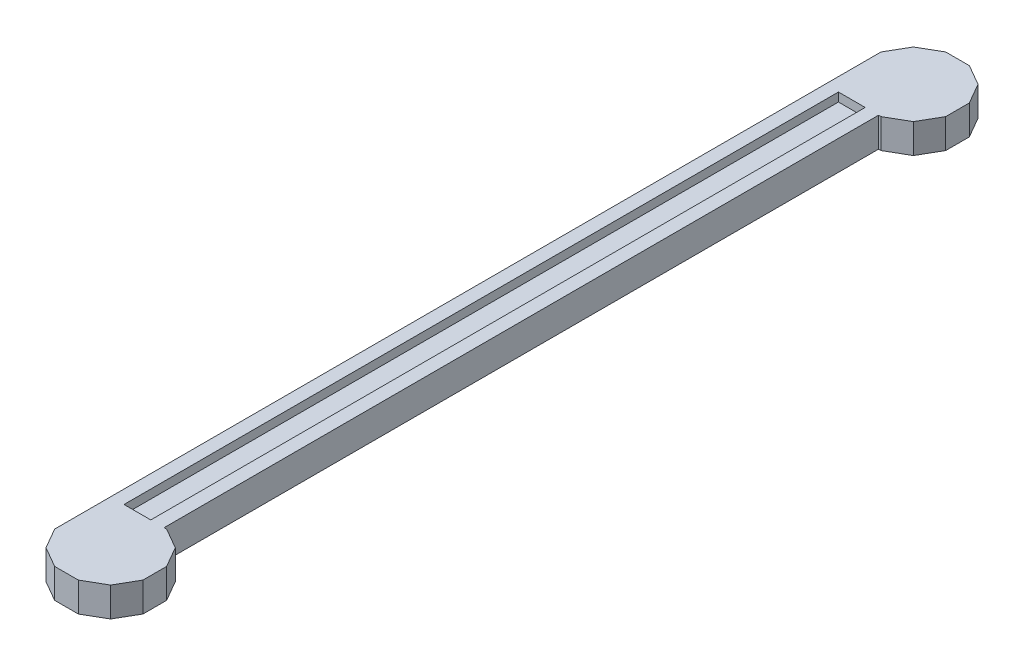
ISO-10303-21;
HEADER;
FILE_DESCRIPTION(('STEP AP214'),'2;1');
FILE_NAME('part.step','',(''),(''),'','','');
FILE_SCHEMA(('AUTOMOTIVE_DESIGN { 1 0 10303 214 1 1 1 1 }'));
ENDSEC;
DATA;
#1=APPLICATION_CONTEXT('core data for automotive mechanical design processes');
#2=APPLICATION_PROTOCOL_DEFINITION('international standard','automotive_design',2000,#1);
#3=PRODUCT_CONTEXT('',#1,'mechanical');
#4=PRODUCT('Part','Part','',(#3));
#5=PRODUCT_RELATED_PRODUCT_CATEGORY('part','',(#4));
#6=PRODUCT_DEFINITION_FORMATION('','',#4);
#7=PRODUCT_DEFINITION_CONTEXT('part definition',#1,'design');
#8=PRODUCT_DEFINITION('design','',#6,#7);
#9=PRODUCT_DEFINITION_SHAPE('','',#8);
#10=(LENGTH_UNIT() NAMED_UNIT(*) SI_UNIT(.MILLI.,.METRE.));
#11=(NAMED_UNIT(*) PLANE_ANGLE_UNIT() SI_UNIT($,.RADIAN.));
#12=(NAMED_UNIT(*) SI_UNIT($,.STERADIAN.) SOLID_ANGLE_UNIT());
#13=UNCERTAINTY_MEASURE_WITH_UNIT(LENGTH_MEASURE(1.E-05),#10,'distance_accuracy_value','');
#14=(GEOMETRIC_REPRESENTATION_CONTEXT(3) GLOBAL_UNCERTAINTY_ASSIGNED_CONTEXT((#13)) GLOBAL_UNIT_ASSIGNED_CONTEXT((#10,
#11,#12)) REPRESENTATION_CONTEXT('',''));
#15=CARTESIAN_POINT('',(0.,0.,0.));
#16=DIRECTION('',(0.,0.,1.));
#17=DIRECTION('',(1.,0.,0.));
#18=AXIS2_PLACEMENT_3D('',#15,#16,#17);
#19=CARTESIAN_POINT('',(33.,-11.,608.842323350227));
#20=DIRECTION('',(1.,0.,0.));
#21=DIRECTION('',(0.,0.,-1.));
#22=AXIS2_PLACEMENT_3D('',#19,#20,#21);
#23=PLANE('',#22);
#24=DIRECTION('',(0.,-1.,0.));
#25=VECTOR('',#24,1.);
#26=CARTESIAN_POINT('',(33.,11.,8.84232335022704));
#27=LINE('',#26,#25);
#28=CARTESIAN_POINT('',(33.,11.,8.84232335022704));
#29=VERTEX_POINT('',#28);
#30=CARTESIAN_POINT('',(33.,-11.,8.84232335022704));
#31=VERTEX_POINT('',#30);
#32=EDGE_CURVE('E312',#29,#31,#27,.T.);
#33=ORIENTED_EDGE('',*,*,#32,.T.);
#34=DIRECTION('',(0.,0.,-1.));
#35=VECTOR('',#34,1.);
#36=CARTESIAN_POINT('',(33.,-11.,608.842323350227));
#37=LINE('',#36,#35);
#38=CARTESIAN_POINT('',(33.,-11.,-8.84232335022705));
#39=VERTEX_POINT('',#38);
#40=EDGE_CURVE('E382',#31,#39,#37,.T.);
#41=ORIENTED_EDGE('',*,*,#40,.T.);
#42=DIRECTION('',(0.,1.,0.));
#43=VECTOR('',#42,1.);
#44=CARTESIAN_POINT('',(33.,-11.,-8.84232335022705));
#45=LINE('',#44,#43);
#46=CARTESIAN_POINT('',(33.,11.,-8.84232335022705));
#47=VERTEX_POINT('',#46);
#48=EDGE_CURVE('E11',#39,#47,#45,.T.);
#49=ORIENTED_EDGE('',*,*,#48,.T.);
#50=DIRECTION('',(0.,0.,-1.));
#51=VECTOR('',#50,1.);
#52=CARTESIAN_POINT('',(33.,11.,608.842323350227));
#53=LINE('',#52,#51);
#54=EDGE_CURVE('E418',#29,#47,#53,.T.);
#55=ORIENTED_EDGE('',*,*,#54,.F.);
#56=EDGE_LOOP('',(#33,#41,#49,#55));
#57=FACE_BOUND('',#56,.T.);
#58=ADVANCED_FACE('F34',(#57),#23,.T.);
#59=CARTESIAN_POINT('',(33.,-11.,-8.84232335022705));
#60=DIRECTION('',(0.866025403784439,0.,-0.499999999999999));
#61=DIRECTION('',(-0.499999999999999,0.,-0.866025403784439));
#62=AXIS2_PLACEMENT_3D('',#59,#60,#61);
#63=PLANE('',#62);
#64=DIRECTION('',(-0.499999999999999,0.,-0.866025403784439));
#65=VECTOR('',#64,1.);
#66=CARTESIAN_POINT('',(33.,11.,-8.84232335022705));
#67=LINE('',#66,#65);
#68=CARTESIAN_POINT('',(24.1576766497729,11.,-24.157676649773));
#69=VERTEX_POINT('',#68);
#70=EDGE_CURVE('E333',#47,#69,#67,.T.);
#71=ORIENTED_EDGE('',*,*,#70,.F.);
#72=ORIENTED_EDGE('',*,*,#48,.F.);
#73=DIRECTION('',(-0.499999999999999,0.,-0.866025403784439));
#74=VECTOR('',#73,1.);
#75=CARTESIAN_POINT('',(33.,-11.,-8.84232335022705));
#76=LINE('',#75,#74);
#77=CARTESIAN_POINT('',(24.1576766497729,-11.,-24.157676649773));
#78=VERTEX_POINT('',#77);
#79=EDGE_CURVE('E348',#39,#78,#76,.T.);
#80=ORIENTED_EDGE('',*,*,#79,.T.);
#81=DIRECTION('',(0.,1.,0.));
#82=VECTOR('',#81,1.);
#83=CARTESIAN_POINT('',(24.1576766497729,-11.,-24.157676649773));
#84=LINE('',#83,#82);
#85=EDGE_CURVE('E38',#78,#69,#84,.T.);
#86=ORIENTED_EDGE('',*,*,#85,.T.);
#87=EDGE_LOOP('',(#71,#72,#80,#86));
#88=FACE_BOUND('',#87,.T.);
#89=ADVANCED_FACE('F36',(#88),#63,.T.);
#90=DIRECTION('',(0.,-1.,0.));
#91=VECTOR('',#90,1.);
#92=CARTESIAN_POINT('',(33.,11.,591.157676649773));
#93=LINE('',#92,#91);
#94=CARTESIAN_POINT('',(33.,11.,591.157676649773));
#95=VERTEX_POINT('',#94);
#96=CARTESIAN_POINT('',(33.,-11.,591.157676649773));
#97=VERTEX_POINT('',#96);
#98=EDGE_CURVE('E344',#95,#97,#93,.T.);
#99=ORIENTED_EDGE('',*,*,#98,.F.);
#100=CARTESIAN_POINT('',(33.,11.,608.842323350227));
#101=VERTEX_POINT('',#100);
#102=EDGE_CURVE('E352',#101,#95,#53,.T.);
#103=ORIENTED_EDGE('',*,*,#102,.F.);
#104=DIRECTION('',(0.,1.,0.));
#105=VECTOR('',#104,1.);
#106=CARTESIAN_POINT('',(33.,-11.,608.842323350227));
#107=LINE('',#106,#105);
#108=CARTESIAN_POINT('',(33.,-11.,608.842323350227));
#109=VERTEX_POINT('',#108);
#110=EDGE_CURVE('E43',#109,#101,#107,.T.);
#111=ORIENTED_EDGE('',*,*,#110,.F.);
#112=EDGE_CURVE('E383',#109,#97,#37,.T.);
#113=ORIENTED_EDGE('',*,*,#112,.T.);
#114=EDGE_LOOP('',(#99,#103,#111,#113));
#115=FACE_BOUND('',#114,.T.);
#116=ADVANCED_FACE('F495',(#115),#23,.T.);
#117=CARTESIAN_POINT('',(24.1576766497731,-11.,624.157676649773));
#118=DIRECTION('',(0.866025403784445,0.,0.49999999999999));
#119=DIRECTION('',(0.49999999999999,0.,-0.866025403784445));
#120=AXIS2_PLACEMENT_3D('',#117,#118,#119);
#121=PLANE('',#120);
#122=DIRECTION('',(0.49999999999999,0.,-0.866025403784445));
#123=VECTOR('',#122,1.);
#124=CARTESIAN_POINT('',(24.1576766497731,11.,624.157676649773));
#125=LINE('',#124,#123);
#126=CARTESIAN_POINT('',(24.1576766497731,11.,624.157676649773));
#127=VERTEX_POINT('',#126);
#128=EDGE_CURVE('E415',#127,#101,#125,.T.);
#129=ORIENTED_EDGE('',*,*,#128,.F.);
#130=DIRECTION('',(0.,1.,0.));
#131=VECTOR('',#130,1.);
#132=CARTESIAN_POINT('',(24.1576766497731,-11.,624.157676649773));
#133=LINE('',#132,#131);
#134=CARTESIAN_POINT('',(24.1576766497731,-11.,624.157676649773));
#135=VERTEX_POINT('',#134);
#136=EDGE_CURVE('E422',#135,#127,#133,.T.);
#137=ORIENTED_EDGE('',*,*,#136,.F.);
#138=DIRECTION('',(0.49999999999999,0.,-0.866025403784445));
#139=VECTOR('',#138,1.);
#140=CARTESIAN_POINT('',(24.1576766497731,-11.,624.157676649773));
#141=LINE('',#140,#139);
#142=EDGE_CURVE('E379',#135,#109,#141,.T.);
#143=ORIENTED_EDGE('',*,*,#142,.T.);
#144=ORIENTED_EDGE('',*,*,#110,.T.);
#145=EDGE_LOOP('',(#129,#137,#143,#144));
#146=FACE_BOUND('',#145,.T.);
#147=ADVANCED_FACE('F491',(#146),#121,.T.);
#148=CARTESIAN_POINT('',(8.84232335022723,-11.,633.));
#149=DIRECTION('',(0.499999999999998,0.,0.86602540378444));
#150=DIRECTION('',(0.86602540378444,0.,-0.499999999999998));
#151=AXIS2_PLACEMENT_3D('',#148,#149,#150);
#152=PLANE('',#151);
#153=DIRECTION('',(0.86602540378444,0.,-0.499999999999997));
#154=VECTOR('',#153,1.);
#155=CARTESIAN_POINT('',(8.84232335022723,11.,633.));
#156=LINE('',#155,#154);
#157=CARTESIAN_POINT('',(8.84232335022723,11.,633.));
#158=VERTEX_POINT('',#157);
#159=EDGE_CURVE('E412',#158,#127,#156,.T.);
#160=ORIENTED_EDGE('',*,*,#159,.F.);
#161=DIRECTION('',(0.,1.,0.));
#162=VECTOR('',#161,1.);
#163=CARTESIAN_POINT('',(8.84232335022723,-11.,633.));
#164=LINE('',#163,#162);
#165=CARTESIAN_POINT('',(8.84232335022723,-11.,633.));
#166=VERTEX_POINT('',#165);
#167=EDGE_CURVE('E424',#166,#158,#164,.T.);
#168=ORIENTED_EDGE('',*,*,#167,.F.);
#169=DIRECTION('',(0.86602540378444,0.,-0.499999999999997));
#170=VECTOR('',#169,1.);
#171=CARTESIAN_POINT('',(8.84232335022723,-11.,633.));
#172=LINE('',#171,#170);
#173=EDGE_CURVE('E376',#166,#135,#172,.T.);
#174=ORIENTED_EDGE('',*,*,#173,.T.);
#175=ORIENTED_EDGE('',*,*,#136,.T.);
#176=EDGE_LOOP('',(#160,#168,#174,#175));
#177=FACE_BOUND('',#176,.T.);
#178=ADVANCED_FACE('F487',(#177),#152,.T.);
#179=CARTESIAN_POINT('',(-8.84232335022699,-11.,633.));
#180=DIRECTION('',(0.,0.,1.));
#181=DIRECTION('',(1.,0.,0.));
#182=AXIS2_PLACEMENT_3D('',#179,#180,#181);
#183=PLANE('',#182);
#184=DIRECTION('',(1.,0.,0.));
#185=VECTOR('',#184,1.);
#186=CARTESIAN_POINT('',(-8.84232335022699,11.,633.));
#187=LINE('',#186,#185);
#188=CARTESIAN_POINT('',(-8.84232335022699,11.,633.));
#189=VERTEX_POINT('',#188);
#190=EDGE_CURVE('E409',#189,#158,#187,.T.);
#191=ORIENTED_EDGE('',*,*,#190,.F.);
#192=DIRECTION('',(0.,1.,0.));
#193=VECTOR('',#192,1.);
#194=CARTESIAN_POINT('',(-8.84232335022699,-11.,633.));
#195=LINE('',#194,#193);
#196=CARTESIAN_POINT('',(-8.84232335022699,-11.,633.));
#197=VERTEX_POINT('',#196);
#198=EDGE_CURVE('E426',#197,#189,#195,.T.);
#199=ORIENTED_EDGE('',*,*,#198,.F.);
#200=DIRECTION('',(1.,0.,0.));
#201=VECTOR('',#200,1.);
#202=CARTESIAN_POINT('',(-8.84232335022699,-11.,633.));
#203=LINE('',#202,#201);
#204=EDGE_CURVE('E373',#197,#166,#203,.T.);
#205=ORIENTED_EDGE('',*,*,#204,.T.);
#206=ORIENTED_EDGE('',*,*,#167,.T.);
#207=EDGE_LOOP('',(#191,#199,#205,#206));
#208=FACE_BOUND('',#207,.T.);
#209=ADVANCED_FACE('F482',(#208),#183,.T.);
#210=CARTESIAN_POINT('',(-24.1576766497729,-11.,624.157676649773));
#211=DIRECTION('',(-0.499999999999994,0.,0.866025403784442));
#212=DIRECTION('',(0.866025403784442,0.,0.499999999999994));
#213=AXIS2_PLACEMENT_3D('',#210,#211,#212);
#214=PLANE('',#213);
#215=DIRECTION('',(0.866025403784442,0.,0.499999999999994));
#216=VECTOR('',#215,1.);
#217=CARTESIAN_POINT('',(-24.1576766497729,11.,624.157676649773));
#218=LINE('',#217,#216);
#219=CARTESIAN_POINT('',(-24.1576766497729,11.,624.157676649773));
#220=VERTEX_POINT('',#219);
#221=EDGE_CURVE('E406',#220,#189,#218,.T.);
#222=ORIENTED_EDGE('',*,*,#221,.F.);
#223=DIRECTION('',(0.,1.,0.));
#224=VECTOR('',#223,1.);
#225=CARTESIAN_POINT('',(-24.1576766497729,-11.,624.157676649773));
#226=LINE('',#225,#224);
#227=CARTESIAN_POINT('',(-24.1576766497729,-11.,624.157676649773));
#228=VERTEX_POINT('',#227);
#229=EDGE_CURVE('E428',#228,#220,#226,.T.);
#230=ORIENTED_EDGE('',*,*,#229,.F.);
#231=DIRECTION('',(0.866025403784442,0.,0.499999999999994));
#232=VECTOR('',#231,1.);
#233=CARTESIAN_POINT('',(-24.1576766497729,-11.,624.157676649773));
#234=LINE('',#233,#232);
#235=EDGE_CURVE('E370',#228,#197,#234,.T.);
#236=ORIENTED_EDGE('',*,*,#235,.T.);
#237=ORIENTED_EDGE('',*,*,#198,.T.);
#238=EDGE_LOOP('',(#222,#230,#236,#237));
#239=FACE_BOUND('',#238,.T.);
#240=ADVANCED_FACE('F478',(#239),#214,.T.);
#241=CARTESIAN_POINT('',(-33.,-11.,608.842323350227));
#242=DIRECTION('',(-0.866025403784442,0.,0.499999999999994));
#243=DIRECTION('',(0.499999999999994,0.,0.866025403784442));
#244=AXIS2_PLACEMENT_3D('',#241,#242,#243);
#245=PLANE('',#244);
#246=DIRECTION('',(0.499999999999994,0.,0.866025403784442));
#247=VECTOR('',#246,1.);
#248=CARTESIAN_POINT('',(-33.,11.,608.842323350227));
#249=LINE('',#248,#247);
#250=CARTESIAN_POINT('',(-33.,11.,608.842323350227));
#251=VERTEX_POINT('',#250);
#252=EDGE_CURVE('E403',#251,#220,#249,.T.);
#253=ORIENTED_EDGE('',*,*,#252,.F.);
#254=DIRECTION('',(0.,1.,0.));
#255=VECTOR('',#254,1.);
#256=CARTESIAN_POINT('',(-33.,-11.,608.842323350227));
#257=LINE('',#256,#255);
#258=CARTESIAN_POINT('',(-33.,-11.,608.842323350227));
#259=VERTEX_POINT('',#258);
#260=EDGE_CURVE('E430',#259,#251,#257,.T.);
#261=ORIENTED_EDGE('',*,*,#260,.F.);
#262=DIRECTION('',(0.499999999999994,0.,0.866025403784442));
#263=VECTOR('',#262,1.);
#264=CARTESIAN_POINT('',(-33.,-11.,608.842323350227));
#265=LINE('',#264,#263);
#266=EDGE_CURVE('E367',#259,#228,#265,.T.);
#267=ORIENTED_EDGE('',*,*,#266,.T.);
#268=ORIENTED_EDGE('',*,*,#229,.T.);
#269=EDGE_LOOP('',(#253,#261,#267,#268));
#270=FACE_BOUND('',#269,.T.);
#271=ADVANCED_FACE('F474',(#270),#245,.T.);
#272=CARTESIAN_POINT('',(-33.,-11.,-8.84232335022704));
#273=DIRECTION('',(-1.,0.,0.));
#274=DIRECTION('',(0.,0.,1.));
#275=AXIS2_PLACEMENT_3D('',#272,#273,#274);
#276=PLANE('',#275);
#277=DIRECTION('',(0.,0.,1.));
#278=VECTOR('',#277,1.);
#279=CARTESIAN_POINT('',(-33.,11.,-8.84232335022704));
#280=LINE('',#279,#278);
#281=CARTESIAN_POINT('',(-33.,11.,-8.84232335022704));
#282=VERTEX_POINT('',#281);
#283=EDGE_CURVE('E400',#282,#251,#280,.T.);
#284=ORIENTED_EDGE('',*,*,#283,.F.);
#285=DIRECTION('',(0.,1.,0.));
#286=VECTOR('',#285,1.);
#287=CARTESIAN_POINT('',(-33.,-11.,-8.84232335022704));
#288=LINE('',#287,#286);
#289=CARTESIAN_POINT('',(-33.,-11.,-8.84232335022704));
#290=VERTEX_POINT('',#289);
#291=EDGE_CURVE('E432',#290,#282,#288,.T.);
#292=ORIENTED_EDGE('',*,*,#291,.F.);
#293=DIRECTION('',(0.,0.,1.));
#294=VECTOR('',#293,1.);
#295=CARTESIAN_POINT('',(-33.,-11.,-8.84232335022704));
#296=LINE('',#295,#294);
#297=EDGE_CURVE('E364',#290,#259,#296,.T.);
#298=ORIENTED_EDGE('',*,*,#297,.T.);
#299=ORIENTED_EDGE('',*,*,#260,.T.);
#300=EDGE_LOOP('',(#284,#292,#298,#299));
#301=FACE_BOUND('',#300,.T.);
#302=ADVANCED_FACE('F470',(#301),#276,.T.);
#303=CARTESIAN_POINT('',(-24.1576766497729,-11.,-24.1576766497729));
#304=DIRECTION('',(-0.866025403784439,0.,-0.5));
#305=DIRECTION('',(-0.5,0.,0.866025403784439));
#306=AXIS2_PLACEMENT_3D('',#303,#304,#305);
#307=PLANE('',#306);
#308=DIRECTION('',(-0.5,0.,0.866025403784439));
#309=VECTOR('',#308,1.);
#310=CARTESIAN_POINT('',(-24.1576766497729,11.,-24.1576766497729));
#311=LINE('',#310,#309);
#312=CARTESIAN_POINT('',(-24.1576766497729,11.,-24.1576766497729));
#313=VERTEX_POINT('',#312);
#314=EDGE_CURVE('E397',#313,#282,#311,.T.);
#315=ORIENTED_EDGE('',*,*,#314,.F.);
#316=DIRECTION('',(0.,1.,0.));
#317=VECTOR('',#316,1.);
#318=CARTESIAN_POINT('',(-24.1576766497729,-11.,-24.1576766497729));
#319=LINE('',#318,#317);
#320=CARTESIAN_POINT('',(-24.1576766497729,-11.,-24.1576766497729));
#321=VERTEX_POINT('',#320);
#322=EDGE_CURVE('E434',#321,#313,#319,.T.);
#323=ORIENTED_EDGE('',*,*,#322,.F.);
#324=DIRECTION('',(-0.5,0.,0.866025403784439));
#325=VECTOR('',#324,1.);
#326=CARTESIAN_POINT('',(-24.1576766497729,-11.,-24.1576766497729));
#327=LINE('',#326,#325);
#328=EDGE_CURVE('E361',#321,#290,#327,.T.);
#329=ORIENTED_EDGE('',*,*,#328,.T.);
#330=ORIENTED_EDGE('',*,*,#291,.T.);
#331=EDGE_LOOP('',(#315,#323,#329,#330));
#332=FACE_BOUND('',#331,.T.);
#333=ADVANCED_FACE('F466',(#332),#307,.T.);
#334=CARTESIAN_POINT('',(-8.84232335022705,-11.,-33.));
#335=DIRECTION('',(-0.5,0.,-0.866025403784439));
#336=DIRECTION('',(-0.866025403784439,0.,0.5));
#337=AXIS2_PLACEMENT_3D('',#334,#335,#336);
#338=PLANE('',#337);
#339=DIRECTION('',(-0.866025403784439,0.,0.5));
#340=VECTOR('',#339,1.);
#341=CARTESIAN_POINT('',(-8.84232335022705,11.,-33.));
#342=LINE('',#341,#340);
#343=CARTESIAN_POINT('',(-8.84232335022705,11.,-33.));
#344=VERTEX_POINT('',#343);
#345=EDGE_CURVE('E394',#344,#313,#342,.T.);
#346=ORIENTED_EDGE('',*,*,#345,.F.);
#347=DIRECTION('',(0.,1.,0.));
#348=VECTOR('',#347,1.);
#349=CARTESIAN_POINT('',(-8.84232335022705,-11.,-33.));
#350=LINE('',#349,#348);
#351=CARTESIAN_POINT('',(-8.84232335022705,-11.,-33.));
#352=VERTEX_POINT('',#351);
#353=EDGE_CURVE('E436',#352,#344,#350,.T.);
#354=ORIENTED_EDGE('',*,*,#353,.F.);
#355=DIRECTION('',(-0.866025403784439,0.,0.5));
#356=VECTOR('',#355,1.);
#357=CARTESIAN_POINT('',(-8.84232335022705,-11.,-33.));
#358=LINE('',#357,#356);
#359=EDGE_CURVE('E358',#352,#321,#358,.T.);
#360=ORIENTED_EDGE('',*,*,#359,.T.);
#361=ORIENTED_EDGE('',*,*,#322,.T.);
#362=EDGE_LOOP('',(#346,#354,#360,#361));
#363=FACE_BOUND('',#362,.T.);
#364=ADVANCED_FACE('F464',(#363),#338,.T.);
#365=CARTESIAN_POINT('',(8.84232335022705,-11.,-33.));
#366=DIRECTION('',(0.,0.,-1.));
#367=DIRECTION('',(-1.,0.,0.));
#368=AXIS2_PLACEMENT_3D('',#365,#366,#367);
#369=PLANE('',#368);
#370=DIRECTION('',(-1.,0.,0.));
#371=VECTOR('',#370,1.);
#372=CARTESIAN_POINT('',(8.84232335022705,11.,-33.));
#373=LINE('',#372,#371);
#374=CARTESIAN_POINT('',(8.84232335022705,11.,-33.));
#375=VERTEX_POINT('',#374);
#376=EDGE_CURVE('E391',#375,#344,#373,.T.);
#377=ORIENTED_EDGE('',*,*,#376,.F.);
#378=DIRECTION('',(0.,1.,0.));
#379=VECTOR('',#378,1.);
#380=CARTESIAN_POINT('',(8.84232335022705,-11.,-33.));
#381=LINE('',#380,#379);
#382=CARTESIAN_POINT('',(8.84232335022705,-11.,-33.));
#383=VERTEX_POINT('',#382);
#384=EDGE_CURVE('E437',#383,#375,#381,.T.);
#385=ORIENTED_EDGE('',*,*,#384,.F.);
#386=DIRECTION('',(-1.,0.,0.));
#387=VECTOR('',#386,1.);
#388=CARTESIAN_POINT('',(8.84232335022705,-11.,-33.));
#389=LINE('',#388,#387);
#390=EDGE_CURVE('E355',#383,#352,#389,.T.);
#391=ORIENTED_EDGE('',*,*,#390,.T.);
#392=ORIENTED_EDGE('',*,*,#353,.T.);
#393=EDGE_LOOP('',(#377,#385,#391,#392));
#394=FACE_BOUND('',#393,.T.);
#395=ADVANCED_FACE('F460',(#394),#369,.T.);
#396=CARTESIAN_POINT('',(24.1576766497729,-11.,-24.157676649773));
#397=DIRECTION('',(0.499999999999998,0.,-0.86602540378444));
#398=DIRECTION('',(-0.86602540378444,0.,-0.499999999999998));
#399=AXIS2_PLACEMENT_3D('',#396,#397,#398);
#400=PLANE('',#399);
#401=DIRECTION('',(-0.86602540378444,0.,-0.499999999999998));
#402=VECTOR('',#401,1.);
#403=CARTESIAN_POINT('',(24.1576766497729,11.,-24.157676649773));
#404=LINE('',#403,#402);
#405=EDGE_CURVE('E388',#69,#375,#404,.T.);
#406=ORIENTED_EDGE('',*,*,#405,.F.);
#407=ORIENTED_EDGE('',*,*,#85,.F.);
#408=DIRECTION('',(-0.86602540378444,0.,-0.499999999999998));
#409=VECTOR('',#408,1.);
#410=CARTESIAN_POINT('',(24.1576766497729,-11.,-24.157676649773));
#411=LINE('',#410,#409);
#412=EDGE_CURVE('E351',#78,#383,#411,.T.);
#413=ORIENTED_EDGE('',*,*,#412,.T.);
#414=ORIENTED_EDGE('',*,*,#384,.T.);
#415=EDGE_LOOP('',(#406,#407,#413,#414));
#416=FACE_BOUND('',#415,.T.);
#417=ADVANCED_FACE('F446',(#416),#400,.T.);
#418=CARTESIAN_POINT('',(0.,-11.,0.));
#419=DIRECTION('',(0.,1.,0.));
#420=DIRECTION('',(0.,0.,1.));
#421=AXIS2_PLACEMENT_3D('',#418,#419,#420);
#422=PLANE('',#421);
#423=DIRECTION('',(-1.,0.,0.));
#424=VECTOR('',#423,1.);
#425=CARTESIAN_POINT('',(-3.,-11.,567.));
#426=LINE('',#425,#424);
#427=CARTESIAN_POINT('',(-3.,-11.,567.));
#428=VERTEX_POINT('',#427);
#429=CARTESIAN_POINT('',(-23.,-11.,567.));
#430=VERTEX_POINT('',#429);
#431=EDGE_CURVE('E274',#428,#430,#426,.T.);
#432=ORIENTED_EDGE('',*,*,#431,.F.);
#433=DIRECTION('',(0.,0.,1.));
#434=VECTOR('',#433,1.);
#435=CARTESIAN_POINT('',(-2.99999999999994,-11.,33.));
#436=LINE('',#435,#434);
#437=CARTESIAN_POINT('',(-2.99999999999994,-11.,33.));
#438=VERTEX_POINT('',#437);
#439=EDGE_CURVE('E59',#438,#428,#436,.T.);
#440=ORIENTED_EDGE('',*,*,#439,.F.);
#441=DIRECTION('',(1.,0.,0.));
#442=VECTOR('',#441,1.);
#443=CARTESIAN_POINT('',(-23.,-11.,33.));
#444=LINE('',#443,#442);
#445=CARTESIAN_POINT('',(-23.,-11.,33.));
#446=VERTEX_POINT('',#445);
#447=EDGE_CURVE('E263',#446,#438,#444,.T.);
#448=ORIENTED_EDGE('',*,*,#447,.F.);
#449=DIRECTION('',(0.,0.,-1.));
#450=VECTOR('',#449,1.);
#451=CARTESIAN_POINT('',(-23.,-11.,567.));
#452=LINE('',#451,#450);
#453=EDGE_CURVE('E277',#430,#446,#452,.T.);
#454=ORIENTED_EDGE('',*,*,#453,.F.);
#455=EDGE_LOOP('',(#432,#440,#448,#454));
#456=FACE_BOUND('',#455,.T.);
#457=ORIENTED_EDGE('',*,*,#40,.F.);
#458=DIRECTION('',(0.5,0.,-0.866025403784439));
#459=VECTOR('',#458,1.);
#460=CARTESIAN_POINT('',(24.1576766497729,-11.,24.1576766497729));
#461=LINE('',#460,#459);
#462=CARTESIAN_POINT('',(24.1576766497729,-11.,24.1576766497729));
#463=VERTEX_POINT('',#462);
#464=EDGE_CURVE('E284',#463,#31,#461,.T.);
#465=ORIENTED_EDGE('',*,*,#464,.F.);
#466=DIRECTION('',(0.866025403784438,0.,-0.5));
#467=VECTOR('',#466,1.);
#468=CARTESIAN_POINT('',(8.84232335022706,-11.,33.));
#469=LINE('',#468,#467);
#470=CARTESIAN_POINT('',(8.84232335022706,-11.,33.));
#471=VERTEX_POINT('',#470);
#472=EDGE_CURVE('E294',#471,#463,#469,.T.);
#473=ORIENTED_EDGE('',*,*,#472,.F.);
#474=DIRECTION('',(1.,0.,0.));
#475=VECTOR('',#474,1.);
#476=CARTESIAN_POINT('',(7.,-11.,33.));
#477=LINE('',#476,#475);
#478=CARTESIAN_POINT('',(7.,-11.,33.));
#479=VERTEX_POINT('',#478);
#480=EDGE_CURVE('E326',#479,#471,#477,.T.);
#481=ORIENTED_EDGE('',*,*,#480,.F.);
#482=DIRECTION('',(0.,0.,-1.));
#483=VECTOR('',#482,1.);
#484=CARTESIAN_POINT('',(7.,-11.,567.));
#485=LINE('',#484,#483);
#486=CARTESIAN_POINT('',(7.,-11.,567.));
#487=VERTEX_POINT('',#486);
#488=EDGE_CURVE('E323',#487,#479,#485,.T.);
#489=ORIENTED_EDGE('',*,*,#488,.F.);
#490=DIRECTION('',(-1.,0.,0.));
#491=VECTOR('',#490,1.);
#492=CARTESIAN_POINT('',(8.84232335022713,-11.,567.));
#493=LINE('',#492,#491);
#494=CARTESIAN_POINT('',(8.84232335022713,-11.,567.));
#495=VERTEX_POINT('',#494);
#496=EDGE_CURVE('E320',#495,#487,#493,.T.);
#497=ORIENTED_EDGE('',*,*,#496,.F.);
#498=DIRECTION('',(-0.86602540378444,0.,-0.499999999999997));
#499=VECTOR('',#498,1.);
#500=CARTESIAN_POINT('',(24.1576766497732,-11.,575.842323350227));
#501=LINE('',#500,#499);
#502=CARTESIAN_POINT('',(24.1576766497732,-11.,575.842323350227));
#503=VERTEX_POINT('',#502);
#504=EDGE_CURVE('E317',#503,#495,#501,.T.);
#505=ORIENTED_EDGE('',*,*,#504,.F.);
#506=DIRECTION('',(-0.499999999999988,0.,-0.866025403784445));
#507=VECTOR('',#506,1.);
#508=CARTESIAN_POINT('',(33.,-11.,591.157676649773));
#509=LINE('',#508,#507);
#510=EDGE_CURVE('E314',#97,#503,#509,.T.);
#511=ORIENTED_EDGE('',*,*,#510,.F.);
#512=ORIENTED_EDGE('',*,*,#112,.F.);
#513=ORIENTED_EDGE('',*,*,#142,.F.);
#514=ORIENTED_EDGE('',*,*,#173,.F.);
#515=ORIENTED_EDGE('',*,*,#204,.F.);
#516=ORIENTED_EDGE('',*,*,#235,.F.);
#517=ORIENTED_EDGE('',*,*,#266,.F.);
#518=ORIENTED_EDGE('',*,*,#297,.F.);
#519=ORIENTED_EDGE('',*,*,#328,.F.);
#520=ORIENTED_EDGE('',*,*,#359,.F.);
#521=ORIENTED_EDGE('',*,*,#390,.F.);
#522=ORIENTED_EDGE('',*,*,#412,.F.);
#523=ORIENTED_EDGE('',*,*,#79,.F.);
#524=EDGE_LOOP('',(#457,#465,#473,#481,#489,#497,#505,#511,#512,#513,#514,#515,#516,#517,#518,
#519,#520,#521,#522,#523));
#525=FACE_BOUND('',#524,.T.);
#526=ADVANCED_FACE('F454',(#456,#525),#422,.F.);
#527=CARTESIAN_POINT('',(0.,11.,0.));
#528=DIRECTION('',(0.,1.,0.));
#529=DIRECTION('',(0.,0.,1.));
#530=AXIS2_PLACEMENT_3D('',#527,#528,#529);
#531=PLANE('',#530);
#532=DIRECTION('',(0.,0.,-1.));
#533=VECTOR('',#532,1.);
#534=CARTESIAN_POINT('',(-3.,11.,567.));
#535=LINE('',#534,#533);
#536=CARTESIAN_POINT('',(-3.,11.,567.));
#537=VERTEX_POINT('',#536);
#538=CARTESIAN_POINT('',(-2.99999999999994,11.,33.));
#539=VERTEX_POINT('',#538);
#540=EDGE_CURVE('E51',#537,#539,#535,.T.);
#541=ORIENTED_EDGE('',*,*,#540,.F.);
#542=DIRECTION('',(1.,0.,0.));
#543=VECTOR('',#542,1.);
#544=CARTESIAN_POINT('',(-23.,11.,567.));
#545=LINE('',#544,#543);
#546=CARTESIAN_POINT('',(-23.,11.,567.));
#547=VERTEX_POINT('',#546);
#548=EDGE_CURVE('E241',#547,#537,#545,.T.);
#549=ORIENTED_EDGE('',*,*,#548,.F.);
#550=DIRECTION('',(0.,0.,1.));
#551=VECTOR('',#550,1.);
#552=CARTESIAN_POINT('',(-23.,11.,33.));
#553=LINE('',#552,#551);
#554=CARTESIAN_POINT('',(-23.,11.,33.));
#555=VERTEX_POINT('',#554);
#556=EDGE_CURVE('E244',#555,#547,#553,.T.);
#557=ORIENTED_EDGE('',*,*,#556,.F.);
#558=DIRECTION('',(-1.,0.,0.));
#559=VECTOR('',#558,1.);
#560=CARTESIAN_POINT('',(-2.99999999999994,11.,33.));
#561=LINE('',#560,#559);
#562=EDGE_CURVE('E250',#539,#555,#561,.T.);
#563=ORIENTED_EDGE('',*,*,#562,.F.);
#564=EDGE_LOOP('',(#541,#549,#557,#563));
#565=FACE_BOUND('',#564,.T.);
#566=DIRECTION('',(0.5,0.,-0.866025403784439));
#567=VECTOR('',#566,1.);
#568=CARTESIAN_POINT('',(24.1576766497729,11.,24.1576766497729));
#569=LINE('',#568,#567);
#570=CARTESIAN_POINT('',(24.1576766497729,11.,24.1576766497729));
#571=VERTEX_POINT('',#570);
#572=EDGE_CURVE('E290',#571,#29,#569,.T.);
#573=ORIENTED_EDGE('',*,*,#572,.T.);
#574=ORIENTED_EDGE('',*,*,#54,.T.);
#575=ORIENTED_EDGE('',*,*,#70,.T.);
#576=ORIENTED_EDGE('',*,*,#405,.T.);
#577=ORIENTED_EDGE('',*,*,#376,.T.);
#578=ORIENTED_EDGE('',*,*,#345,.T.);
#579=ORIENTED_EDGE('',*,*,#314,.T.);
#580=ORIENTED_EDGE('',*,*,#283,.T.);
#581=ORIENTED_EDGE('',*,*,#252,.T.);
#582=ORIENTED_EDGE('',*,*,#221,.T.);
#583=ORIENTED_EDGE('',*,*,#190,.T.);
#584=ORIENTED_EDGE('',*,*,#159,.T.);
#585=ORIENTED_EDGE('',*,*,#128,.T.);
#586=ORIENTED_EDGE('',*,*,#102,.T.);
#587=DIRECTION('',(-0.499999999999988,0.,-0.866025403784445));
#588=VECTOR('',#587,1.);
#589=CARTESIAN_POINT('',(33.,11.,591.157676649773));
#590=LINE('',#589,#588);
#591=CARTESIAN_POINT('',(24.1576766497731,11.,575.842323350227));
#592=VERTEX_POINT('',#591);
#593=EDGE_CURVE('E293',#95,#592,#590,.T.);
#594=ORIENTED_EDGE('',*,*,#593,.T.);
#595=DIRECTION('',(-0.86602540378444,0.,-0.499999999999997));
#596=VECTOR('',#595,1.);
#597=CARTESIAN_POINT('',(24.1576766497732,11.,575.842323350227));
#598=LINE('',#597,#596);
#599=CARTESIAN_POINT('',(8.84232335022713,11.,567.));
#600=VERTEX_POINT('',#599);
#601=EDGE_CURVE('E297',#592,#600,#598,.T.);
#602=ORIENTED_EDGE('',*,*,#601,.T.);
#603=DIRECTION('',(-1.,0.,0.));
#604=VECTOR('',#603,1.);
#605=CARTESIAN_POINT('',(8.84232335022713,11.,567.));
#606=LINE('',#605,#604);
#607=CARTESIAN_POINT('',(7.,11.,567.));
#608=VERTEX_POINT('',#607);
#609=EDGE_CURVE('E300',#600,#608,#606,.T.);
#610=ORIENTED_EDGE('',*,*,#609,.T.);
#611=DIRECTION('',(0.,0.,-1.));
#612=VECTOR('',#611,1.);
#613=CARTESIAN_POINT('',(7.,11.,567.));
#614=LINE('',#613,#612);
#615=CARTESIAN_POINT('',(7.,11.,33.));
#616=VERTEX_POINT('',#615);
#617=EDGE_CURVE('E303',#608,#616,#614,.T.);
#618=ORIENTED_EDGE('',*,*,#617,.T.);
#619=DIRECTION('',(1.,0.,0.));
#620=VECTOR('',#619,1.);
#621=CARTESIAN_POINT('',(7.,11.,33.));
#622=LINE('',#621,#620);
#623=CARTESIAN_POINT('',(8.84232335022706,11.,33.));
#624=VERTEX_POINT('',#623);
#625=EDGE_CURVE('E306',#616,#624,#622,.T.);
#626=ORIENTED_EDGE('',*,*,#625,.T.);
#627=DIRECTION('',(0.866025403784438,0.,-0.5));
#628=VECTOR('',#627,1.);
#629=CARTESIAN_POINT('',(8.84232335022706,11.,33.));
#630=LINE('',#629,#628);
#631=EDGE_CURVE('E309',#624,#571,#630,.T.);
#632=ORIENTED_EDGE('',*,*,#631,.T.);
#633=EDGE_LOOP('',(#573,#574,#575,#576,#577,#578,#579,#580,#581,#582,#583,#584,#585,#586,#594,
#602,#610,#618,#626,#632));
#634=FACE_BOUND('',#633,.T.);
#635=ADVANCED_FACE('F448',(#565,#634),#531,.T.);
#636=CARTESIAN_POINT('',(24.1576766497729,11.,24.1576766497729));
#637=DIRECTION('',(-0.866025403784439,0.,-0.5));
#638=DIRECTION('',(-0.5,0.,0.866025403784439));
#639=AXIS2_PLACEMENT_3D('',#636,#637,#638);
#640=PLANE('',#639);
#641=ORIENTED_EDGE('',*,*,#464,.T.);
#642=ORIENTED_EDGE('',*,*,#32,.F.);
#643=ORIENTED_EDGE('',*,*,#572,.F.);
#644=DIRECTION('',(0.,-1.,0.));
#645=VECTOR('',#644,1.);
#646=CARTESIAN_POINT('',(24.1576766497729,11.,24.1576766497729));
#647=LINE('',#646,#645);
#648=EDGE_CURVE('E331',#571,#463,#647,.T.);
#649=ORIENTED_EDGE('',*,*,#648,.T.);
#650=EDGE_LOOP('',(#641,#642,#643,#649));
#651=FACE_BOUND('',#650,.T.);
#652=ADVANCED_FACE('F520',(#651),#640,.F.);
#653=CARTESIAN_POINT('',(8.84232335022706,11.,33.));
#654=DIRECTION('',(-0.5,0.,-0.866025403784438));
#655=DIRECTION('',(-0.866025403784438,0.,0.5));
#656=AXIS2_PLACEMENT_3D('',#653,#654,#655);
#657=PLANE('',#656);
#658=ORIENTED_EDGE('',*,*,#472,.T.);
#659=ORIENTED_EDGE('',*,*,#648,.F.);
#660=ORIENTED_EDGE('',*,*,#631,.F.);
#661=DIRECTION('',(0.,-1.,0.));
#662=VECTOR('',#661,1.);
#663=CARTESIAN_POINT('',(8.84232335022706,11.,33.));
#664=LINE('',#663,#662);
#665=EDGE_CURVE('E334',#624,#471,#664,.T.);
#666=ORIENTED_EDGE('',*,*,#665,.T.);
#667=EDGE_LOOP('',(#658,#659,#660,#666));
#668=FACE_BOUND('',#667,.T.);
#669=ADVANCED_FACE('F518',(#668),#657,.F.);
#670=CARTESIAN_POINT('',(7.,11.,33.));
#671=DIRECTION('',(0.,0.,-1.));
#672=DIRECTION('',(-1.,0.,0.));
#673=AXIS2_PLACEMENT_3D('',#670,#671,#672);
#674=PLANE('',#673);
#675=ORIENTED_EDGE('',*,*,#480,.T.);
#676=ORIENTED_EDGE('',*,*,#665,.F.);
#677=ORIENTED_EDGE('',*,*,#625,.F.);
#678=DIRECTION('',(0.,-1.,0.));
#679=VECTOR('',#678,1.);
#680=CARTESIAN_POINT('',(7.,11.,33.));
#681=LINE('',#680,#679);
#682=EDGE_CURVE('E336',#616,#479,#681,.T.);
#683=ORIENTED_EDGE('',*,*,#682,.T.);
#684=EDGE_LOOP('',(#675,#676,#677,#683));
#685=FACE_BOUND('',#684,.T.);
#686=ADVANCED_FACE('F514',(#685),#674,.F.);
#687=CARTESIAN_POINT('',(7.,11.,567.));
#688=DIRECTION('',(-1.,0.,0.));
#689=DIRECTION('',(0.,0.,1.));
#690=AXIS2_PLACEMENT_3D('',#687,#688,#689);
#691=PLANE('',#690);
#692=ORIENTED_EDGE('',*,*,#488,.T.);
#693=ORIENTED_EDGE('',*,*,#682,.F.);
#694=ORIENTED_EDGE('',*,*,#617,.F.);
#695=DIRECTION('',(0.,-1.,0.));
#696=VECTOR('',#695,1.);
#697=CARTESIAN_POINT('',(7.,11.,567.));
#698=LINE('',#697,#696);
#699=EDGE_CURVE('E338',#608,#487,#698,.T.);
#700=ORIENTED_EDGE('',*,*,#699,.T.);
#701=EDGE_LOOP('',(#692,#693,#694,#700));
#702=FACE_BOUND('',#701,.T.);
#703=ADVANCED_FACE('F510',(#702),#691,.F.);
#704=CARTESIAN_POINT('',(8.84232335022713,11.,567.));
#705=DIRECTION('',(0.,0.,1.));
#706=DIRECTION('',(1.,0.,0.));
#707=AXIS2_PLACEMENT_3D('',#704,#705,#706);
#708=PLANE('',#707);
#709=ORIENTED_EDGE('',*,*,#496,.T.);
#710=ORIENTED_EDGE('',*,*,#699,.F.);
#711=ORIENTED_EDGE('',*,*,#609,.F.);
#712=DIRECTION('',(0.,-1.,0.));
#713=VECTOR('',#712,1.);
#714=CARTESIAN_POINT('',(8.84232335022713,11.,567.));
#715=LINE('',#714,#713);
#716=EDGE_CURVE('E340',#600,#495,#715,.T.);
#717=ORIENTED_EDGE('',*,*,#716,.T.);
#718=EDGE_LOOP('',(#709,#710,#711,#717));
#719=FACE_BOUND('',#718,.T.);
#720=ADVANCED_FACE('F506',(#719),#708,.F.);
#721=CARTESIAN_POINT('',(24.1576766497732,11.,575.842323350227));
#722=DIRECTION('',(-0.499999999999997,0.,0.86602540378444));
#723=DIRECTION('',(0.86602540378444,0.,0.499999999999997));
#724=AXIS2_PLACEMENT_3D('',#721,#722,#723);
#725=PLANE('',#724);
#726=ORIENTED_EDGE('',*,*,#504,.T.);
#727=ORIENTED_EDGE('',*,*,#716,.F.);
#728=ORIENTED_EDGE('',*,*,#601,.F.);
#729=DIRECTION('',(0.,-1.,0.));
#730=VECTOR('',#729,1.);
#731=CARTESIAN_POINT('',(24.1576766497732,11.,575.842323350227));
#732=LINE('',#731,#730);
#733=EDGE_CURVE('E342',#592,#503,#732,.T.);
#734=ORIENTED_EDGE('',*,*,#733,.T.);
#735=EDGE_LOOP('',(#726,#727,#728,#734));
#736=FACE_BOUND('',#735,.T.);
#737=ADVANCED_FACE('F502',(#736),#725,.F.);
#738=CARTESIAN_POINT('',(33.,11.,591.157676649773));
#739=DIRECTION('',(-0.866025403784445,0.,0.499999999999988));
#740=DIRECTION('',(0.499999999999988,0.,0.866025403784445));
#741=AXIS2_PLACEMENT_3D('',#738,#739,#740);
#742=PLANE('',#741);
#743=ORIENTED_EDGE('',*,*,#510,.T.);
#744=ORIENTED_EDGE('',*,*,#733,.F.);
#745=ORIENTED_EDGE('',*,*,#593,.F.);
#746=ORIENTED_EDGE('',*,*,#98,.T.);
#747=EDGE_LOOP('',(#743,#744,#745,#746));
#748=FACE_BOUND('',#747,.T.);
#749=ADVANCED_FACE('F498',(#748),#742,.F.);
#750=CARTESIAN_POINT('',(-2.99999999999994,-4.5,33.));
#751=DIRECTION('',(1.,0.,0.));
#752=DIRECTION('',(0.,0.,-1.));
#753=AXIS2_PLACEMENT_3D('',#750,#751,#752);
#754=PLANE('',#753);
#755=ORIENTED_EDGE('',*,*,#439,.T.);
#756=DIRECTION('',(0.,-1.,0.));
#757=VECTOR('',#756,1.);
#758=CARTESIAN_POINT('',(-3.,-4.5,567.));
#759=LINE('',#758,#757);
#760=CARTESIAN_POINT('',(-3.,-4.5,567.));
#761=VERTEX_POINT('',#760);
#762=EDGE_CURVE('E272',#761,#428,#759,.T.);
#763=ORIENTED_EDGE('',*,*,#762,.F.);
#764=DIRECTION('',(0.,0.,1.));
#765=VECTOR('',#764,1.);
#766=CARTESIAN_POINT('',(-2.99999999999994,-4.5,33.));
#767=LINE('',#766,#765);
#768=CARTESIAN_POINT('',(-2.99999999999994,-4.5,33.));
#769=VERTEX_POINT('',#768);
#770=EDGE_CURVE('E259',#769,#761,#767,.T.);
#771=ORIENTED_EDGE('',*,*,#770,.F.);
#772=DIRECTION('',(0.,-1.,0.));
#773=VECTOR('',#772,1.);
#774=CARTESIAN_POINT('',(-2.99999999999994,-4.5,33.));
#775=LINE('',#774,#773);
#776=EDGE_CURVE('E282',#769,#438,#775,.T.);
#777=ORIENTED_EDGE('',*,*,#776,.T.);
#778=EDGE_LOOP('',(#755,#763,#771,#777));
#779=FACE_BOUND('',#778,.T.);
#780=ADVANCED_FACE('F575',(#779),#754,.F.);
#781=CARTESIAN_POINT('',(-23.,-4.5,33.));
#782=DIRECTION('',(0.,0.,-1.));
#783=DIRECTION('',(-1.,0.,0.));
#784=AXIS2_PLACEMENT_3D('',#781,#782,#783);
#785=PLANE('',#784);
#786=ORIENTED_EDGE('',*,*,#447,.T.);
#787=ORIENTED_EDGE('',*,*,#776,.F.);
#788=DIRECTION('',(1.,0.,0.));
#789=VECTOR('',#788,1.);
#790=CARTESIAN_POINT('',(-23.,-4.5,33.));
#791=LINE('',#790,#789);
#792=CARTESIAN_POINT('',(-23.,-4.5,33.));
#793=VERTEX_POINT('',#792);
#794=EDGE_CURVE('E269',#793,#769,#791,.T.);
#795=ORIENTED_EDGE('',*,*,#794,.F.);
#796=DIRECTION('',(0.,-1.,0.));
#797=VECTOR('',#796,1.);
#798=CARTESIAN_POINT('',(-23.,-4.5,33.));
#799=LINE('',#798,#797);
#800=EDGE_CURVE('E285',#793,#446,#799,.T.);
#801=ORIENTED_EDGE('',*,*,#800,.T.);
#802=EDGE_LOOP('',(#786,#787,#795,#801));
#803=FACE_BOUND('',#802,.T.);
#804=ADVANCED_FACE('F580',(#803),#785,.F.);
#805=CARTESIAN_POINT('',(-23.,-4.5,567.));
#806=DIRECTION('',(-1.,0.,0.));
#807=DIRECTION('',(0.,0.,1.));
#808=AXIS2_PLACEMENT_3D('',#805,#806,#807);
#809=PLANE('',#808);
#810=ORIENTED_EDGE('',*,*,#453,.T.);
#811=ORIENTED_EDGE('',*,*,#800,.F.);
#812=DIRECTION('',(0.,0.,-1.));
#813=VECTOR('',#812,1.);
#814=CARTESIAN_POINT('',(-23.,-4.5,567.));
#815=LINE('',#814,#813);
#816=CARTESIAN_POINT('',(-23.,-4.5,567.));
#817=VERTEX_POINT('',#816);
#818=EDGE_CURVE('E266',#817,#793,#815,.T.);
#819=ORIENTED_EDGE('',*,*,#818,.F.);
#820=DIRECTION('',(0.,-1.,0.));
#821=VECTOR('',#820,1.);
#822=CARTESIAN_POINT('',(-23.,-4.5,567.));
#823=LINE('',#822,#821);
#824=EDGE_CURVE('E287',#817,#430,#823,.T.);
#825=ORIENTED_EDGE('',*,*,#824,.T.);
#826=EDGE_LOOP('',(#810,#811,#819,#825));
#827=FACE_BOUND('',#826,.T.);
#828=ADVANCED_FACE('F582',(#827),#809,.F.);
#829=CARTESIAN_POINT('',(-3.,-4.5,567.));
#830=DIRECTION('',(0.,0.,1.));
#831=DIRECTION('',(1.,0.,0.));
#832=AXIS2_PLACEMENT_3D('',#829,#830,#831);
#833=PLANE('',#832);
#834=ORIENTED_EDGE('',*,*,#431,.T.);
#835=ORIENTED_EDGE('',*,*,#824,.F.);
#836=DIRECTION('',(-1.,0.,0.));
#837=VECTOR('',#836,1.);
#838=CARTESIAN_POINT('',(-3.,-4.5,567.));
#839=LINE('',#838,#837);
#840=EDGE_CURVE('E262',#761,#817,#839,.T.);
#841=ORIENTED_EDGE('',*,*,#840,.F.);
#842=ORIENTED_EDGE('',*,*,#762,.T.);
#843=EDGE_LOOP('',(#834,#835,#841,#842));
#844=FACE_BOUND('',#843,.T.);
#845=ADVANCED_FACE('F571',(#844),#833,.F.);
#846=CARTESIAN_POINT('',(0.,-4.5,0.));
#847=DIRECTION('',(0.,-1.,0.));
#848=DIRECTION('',(0.,0.,-1.));
#849=AXIS2_PLACEMENT_3D('',#846,#847,#848);
#850=PLANE('',#849);
#851=ORIENTED_EDGE('',*,*,#770,.T.);
#852=ORIENTED_EDGE('',*,*,#840,.T.);
#853=ORIENTED_EDGE('',*,*,#818,.T.);
#854=ORIENTED_EDGE('',*,*,#794,.T.);
#855=EDGE_LOOP('',(#851,#852,#853,#854));
#856=FACE_BOUND('',#855,.T.);
#857=ADVANCED_FACE('F578',(#856),#850,.T.);
#858=CARTESIAN_POINT('',(-3.,4.5,567.));
#859=DIRECTION('',(1.,0.,0.));
#860=DIRECTION('',(0.,0.,-1.));
#861=AXIS2_PLACEMENT_3D('',#858,#859,#860);
#862=PLANE('',#861);
#863=ORIENTED_EDGE('',*,*,#540,.T.);
#864=DIRECTION('',(0.,1.,0.));
#865=VECTOR('',#864,1.);
#866=CARTESIAN_POINT('',(-2.99999999999994,4.5,33.));
#867=LINE('',#866,#865);
#868=CARTESIAN_POINT('',(-2.99999999999994,4.5,33.));
#869=VERTEX_POINT('',#868);
#870=EDGE_CURVE('E219',#869,#539,#867,.T.);
#871=ORIENTED_EDGE('',*,*,#870,.F.);
#872=DIRECTION('',(0.,0.,-1.));
#873=VECTOR('',#872,1.);
#874=CARTESIAN_POINT('',(-3.,4.5,567.));
#875=LINE('',#874,#873);
#876=CARTESIAN_POINT('',(-3.,4.5,567.));
#877=VERTEX_POINT('',#876);
#878=EDGE_CURVE('E223',#877,#869,#875,.T.);
#879=ORIENTED_EDGE('',*,*,#878,.F.);
#880=DIRECTION('',(0.,1.,0.));
#881=VECTOR('',#880,1.);
#882=CARTESIAN_POINT('',(-3.,4.5,567.));
#883=LINE('',#882,#881);
#884=EDGE_CURVE('E254',#877,#537,#883,.T.);
#885=ORIENTED_EDGE('',*,*,#884,.T.);
#886=EDGE_LOOP('',(#863,#871,#879,#885));
#887=FACE_BOUND('',#886,.T.);
#888=ADVANCED_FACE('F221',(#887),#862,.F.);
#889=CARTESIAN_POINT('',(-23.,4.5,567.));
#890=DIRECTION('',(0.,0.,1.));
#891=DIRECTION('',(1.,0.,0.));
#892=AXIS2_PLACEMENT_3D('',#889,#890,#891);
#893=PLANE('',#892);
#894=ORIENTED_EDGE('',*,*,#548,.T.);
#895=ORIENTED_EDGE('',*,*,#884,.F.);
#896=DIRECTION('',(1.,0.,0.));
#897=VECTOR('',#896,1.);
#898=CARTESIAN_POINT('',(-23.,4.5,567.));
#899=LINE('',#898,#897);
#900=CARTESIAN_POINT('',(-23.,4.5,567.));
#901=VERTEX_POINT('',#900);
#902=EDGE_CURVE('E229',#901,#877,#899,.T.);
#903=ORIENTED_EDGE('',*,*,#902,.F.);
#904=DIRECTION('',(0.,1.,0.));
#905=VECTOR('',#904,1.);
#906=CARTESIAN_POINT('',(-23.,4.5,567.));
#907=LINE('',#906,#905);
#908=EDGE_CURVE('E256',#901,#547,#907,.T.);
#909=ORIENTED_EDGE('',*,*,#908,.T.);
#910=EDGE_LOOP('',(#894,#895,#903,#909));
#911=FACE_BOUND('',#910,.T.);
#912=ADVANCED_FACE('F649',(#911),#893,.F.);
#913=CARTESIAN_POINT('',(-23.,4.5,33.));
#914=DIRECTION('',(-1.,0.,0.));
#915=DIRECTION('',(0.,0.,1.));
#916=AXIS2_PLACEMENT_3D('',#913,#914,#915);
#917=PLANE('',#916);
#918=ORIENTED_EDGE('',*,*,#556,.T.);
#919=ORIENTED_EDGE('',*,*,#908,.F.);
#920=DIRECTION('',(0.,0.,1.));
#921=VECTOR('',#920,1.);
#922=CARTESIAN_POINT('',(-23.,4.5,33.));
#923=LINE('',#922,#921);
#924=CARTESIAN_POINT('',(-23.,4.5,33.));
#925=VERTEX_POINT('',#924);
#926=EDGE_CURVE('E237',#925,#901,#923,.T.);
#927=ORIENTED_EDGE('',*,*,#926,.F.);
#928=DIRECTION('',(0.,1.,0.));
#929=VECTOR('',#928,1.);
#930=CARTESIAN_POINT('',(-23.,4.5,33.));
#931=LINE('',#930,#929);
#932=EDGE_CURVE('E228',#925,#555,#931,.T.);
#933=ORIENTED_EDGE('',*,*,#932,.T.);
#934=EDGE_LOOP('',(#918,#919,#927,#933));
#935=FACE_BOUND('',#934,.T.);
#936=ADVANCED_FACE('F658',(#935),#917,.F.);
#937=CARTESIAN_POINT('',(-2.99999999999994,4.5,33.));
#938=DIRECTION('',(0.,0.,-1.));
#939=DIRECTION('',(-1.,0.,0.));
#940=AXIS2_PLACEMENT_3D('',#937,#938,#939);
#941=PLANE('',#940);
#942=ORIENTED_EDGE('',*,*,#562,.T.);
#943=ORIENTED_EDGE('',*,*,#932,.F.);
#944=DIRECTION('',(-1.,0.,0.));
#945=VECTOR('',#944,1.);
#946=CARTESIAN_POINT('',(-2.99999999999994,4.5,33.));
#947=LINE('',#946,#945);
#948=EDGE_CURVE('E232',#869,#925,#947,.T.);
#949=ORIENTED_EDGE('',*,*,#948,.F.);
#950=ORIENTED_EDGE('',*,*,#870,.T.);
#951=EDGE_LOOP('',(#942,#943,#949,#950));
#952=FACE_BOUND('',#951,.T.);
#953=ADVANCED_FACE('F233',(#952),#941,.F.);
#954=CARTESIAN_POINT('',(0.,4.5,0.));
#955=DIRECTION('',(0.,1.,0.));
#956=DIRECTION('',(0.,0.,1.));
#957=AXIS2_PLACEMENT_3D('',#954,#955,#956);
#958=PLANE('',#957);
#959=ORIENTED_EDGE('',*,*,#878,.T.);
#960=ORIENTED_EDGE('',*,*,#948,.T.);
#961=ORIENTED_EDGE('',*,*,#926,.T.);
#962=ORIENTED_EDGE('',*,*,#902,.T.);
#963=EDGE_LOOP('',(#959,#960,#961,#962));
#964=FACE_BOUND('',#963,.T.);
#965=ADVANCED_FACE('F239',(#964),#958,.T.);
#966=CLOSED_SHELL('',(#58,#89,#116,#147,#178,#209,#240,#271,#302,#333,#364,#395,#417,#526,#635,
#652,#669,#686,#703,#720,#737,#749,#780,#804,#828,#845,#857,#888,#912,#936,#953,#965));
#967=MANIFOLD_SOLID_BREP('B2',#966);
#968=ADVANCED_BREP_SHAPE_REPRESENTATION('',(#18,#967),#14);
#969=SHAPE_DEFINITION_REPRESENTATION(#9,#968);
ENDSEC;
END-ISO-10303-21;
